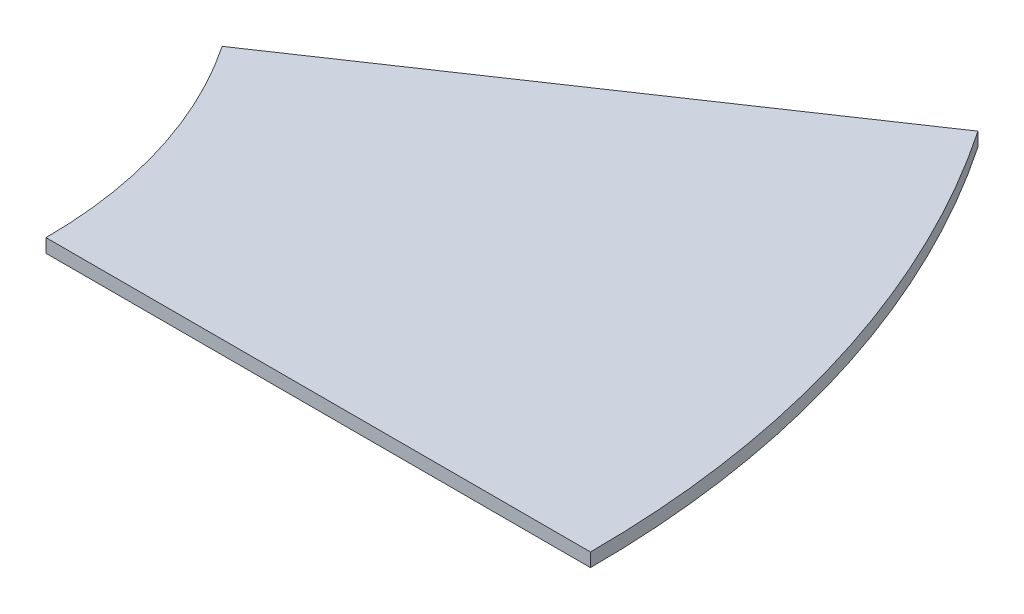
ISO-10303-21;
HEADER;
FILE_DESCRIPTION(('STEP AP214'),'2;1');
FILE_NAME('part.step','',(''),(''),'','','');
FILE_SCHEMA(('AUTOMOTIVE_DESIGN { 1 0 10303 214 1 1 1 1 }'));
ENDSEC;
DATA;
#1=APPLICATION_CONTEXT('core data for automotive mechanical design processes');
#2=APPLICATION_PROTOCOL_DEFINITION('international standard','automotive_design',2000,#1);
#3=PRODUCT_CONTEXT('',#1,'mechanical');
#4=PRODUCT('Part','Part','',(#3));
#5=PRODUCT_RELATED_PRODUCT_CATEGORY('part','',(#4));
#6=PRODUCT_DEFINITION_FORMATION('','',#4);
#7=PRODUCT_DEFINITION_CONTEXT('part definition',#1,'design');
#8=PRODUCT_DEFINITION('design','',#6,#7);
#9=PRODUCT_DEFINITION_SHAPE('','',#8);
#10=(LENGTH_UNIT() NAMED_UNIT(*) SI_UNIT(.MILLI.,.METRE.));
#11=(NAMED_UNIT(*) PLANE_ANGLE_UNIT() SI_UNIT($,.RADIAN.));
#12=(NAMED_UNIT(*) SI_UNIT($,.STERADIAN.) SOLID_ANGLE_UNIT());
#13=UNCERTAINTY_MEASURE_WITH_UNIT(LENGTH_MEASURE(1.E-05),#10,'distance_accuracy_value','');
#14=(GEOMETRIC_REPRESENTATION_CONTEXT(3) GLOBAL_UNCERTAINTY_ASSIGNED_CONTEXT((#13)) GLOBAL_UNIT_ASSIGNED_CONTEXT((#10,
#11,#12)) REPRESENTATION_CONTEXT('',''));
#15=CARTESIAN_POINT('',(0.,0.,0.));
#16=DIRECTION('',(0.,0.,1.));
#17=DIRECTION('',(1.,0.,0.));
#18=AXIS2_PLACEMENT_3D('',#15,#16,#17);
#19=CARTESIAN_POINT('',(0.,1.5,0.));
#20=DIRECTION('',(0.,-1.,0.));
#21=DIRECTION('',(0.,0.,-1.));
#22=AXIS2_PLACEMENT_3D('',#19,#20,#21);
#23=CYLINDRICAL_SURFACE('',#22,110.);
#24=CARTESIAN_POINT('',(0.,0.,0.));
#25=DIRECTION('',(0.,1.,0.));
#26=DIRECTION('',(0.,0.,1.));
#27=AXIS2_PLACEMENT_3D('',#24,#25,#26);
#28=CIRCLE('',#27,110.);
#29=CARTESIAN_POINT('',(110.,0.,0.));
#30=VERTEX_POINT('',#29);
#31=CARTESIAN_POINT('',(91.1941329810549,0.,-61.5112193817816));
#32=VERTEX_POINT('',#31);
#33=EDGE_CURVE('E97',#30,#32,#28,.T.);
#34=ORIENTED_EDGE('',*,*,#33,.T.);
#35=DIRECTION('',(0.,-1.,0.));
#36=VECTOR('',#35,1.);
#37=CARTESIAN_POINT('',(91.1941329810549,1.5,-61.5112193817816));
#38=LINE('',#37,#36);
#39=CARTESIAN_POINT('',(91.1941329810549,1.5,-61.5112193817816));
#40=VERTEX_POINT('',#39);
#41=EDGE_CURVE('E11',#40,#32,#38,.T.);
#42=ORIENTED_EDGE('',*,*,#41,.F.);
#43=CARTESIAN_POINT('',(0.,1.5,0.));
#44=DIRECTION('',(0.,1.,0.));
#45=DIRECTION('',(0.,0.,1.));
#46=AXIS2_PLACEMENT_3D('',#43,#44,#45);
#47=CIRCLE('',#46,110.);
#48=CARTESIAN_POINT('',(110.,1.5,0.));
#49=VERTEX_POINT('',#48);
#50=EDGE_CURVE('E83',#49,#40,#47,.T.);
#51=ORIENTED_EDGE('',*,*,#50,.F.);
#52=DIRECTION('',(0.,-1.,0.));
#53=VECTOR('',#52,1.);
#54=CARTESIAN_POINT('',(110.,1.5,0.));
#55=LINE('',#54,#53);
#56=EDGE_CURVE('E50',#49,#30,#55,.T.);
#57=ORIENTED_EDGE('',*,*,#56,.T.);
#58=EDGE_LOOP('',(#34,#42,#51,#57));
#59=FACE_BOUND('',#58,.T.);
#60=ADVANCED_FACE('F34',(#59),#23,.T.);
#61=CARTESIAN_POINT('',(91.1941329810549,1.5,-61.5112193817816));
#62=DIRECTION('',(0.559192903470742,0.,0.829037572555045));
#63=DIRECTION('',(0.829037572555045,0.,-0.559192903470742));
#64=AXIS2_PLACEMENT_3D('',#61,#62,#63);
#65=PLANE('',#64);
#66=DIRECTION('',(-0.829037572555045,0.,0.559192903470742));
#67=VECTOR('',#66,1.);
#68=CARTESIAN_POINT('',(91.1941329810549,0.,-61.5112193817816));
#69=LINE('',#68,#67);
#70=CARTESIAN_POINT('',(41.4518786277522,0.,-27.9596451735371));
#71=VERTEX_POINT('',#70);
#72=EDGE_CURVE('E88',#32,#71,#69,.T.);
#73=ORIENTED_EDGE('',*,*,#72,.T.);
#74=DIRECTION('',(0.,-1.,0.));
#75=VECTOR('',#74,1.);
#76=CARTESIAN_POINT('',(41.4518786277522,1.5,-27.9596451735371));
#77=LINE('',#76,#75);
#78=CARTESIAN_POINT('',(41.4518786277522,1.5,-27.9596451735371));
#79=VERTEX_POINT('',#78);
#80=EDGE_CURVE('E42',#79,#71,#77,.T.);
#81=ORIENTED_EDGE('',*,*,#80,.F.);
#82=DIRECTION('',(-0.829037572555045,0.,0.559192903470742));
#83=VECTOR('',#82,1.);
#84=CARTESIAN_POINT('',(91.1941329810549,1.5,-61.5112193817816));
#85=LINE('',#84,#83);
#86=EDGE_CURVE('E75',#40,#79,#85,.T.);
#87=ORIENTED_EDGE('',*,*,#86,.F.);
#88=ORIENTED_EDGE('',*,*,#41,.T.);
#89=EDGE_LOOP('',(#73,#81,#87,#88));
#90=FACE_BOUND('',#89,.T.);
#91=ADVANCED_FACE('F87',(#90),#65,.F.);
#92=CARTESIAN_POINT('',(0.,1.5,0.));
#93=DIRECTION('',(0.,-1.,0.));
#94=DIRECTION('',(0.,0.,-1.));
#95=AXIS2_PLACEMENT_3D('',#92,#93,#94);
#96=CYLINDRICAL_SURFACE('',#95,50.);
#97=CARTESIAN_POINT('',(0.,0.,0.));
#98=DIRECTION('',(0.,1.,0.));
#99=DIRECTION('',(0.,0.,1.));
#100=AXIS2_PLACEMENT_3D('',#97,#98,#99);
#101=CIRCLE('',#100,50.);
#102=CARTESIAN_POINT('',(50.,0.,0.));
#103=VERTEX_POINT('',#102);
#104=EDGE_CURVE('E100',#103,#71,#101,.T.);
#105=ORIENTED_EDGE('',*,*,#104,.F.);
#106=DIRECTION('',(0.,-1.,0.));
#107=VECTOR('',#106,1.);
#108=CARTESIAN_POINT('',(50.,1.5,0.));
#109=LINE('',#108,#107);
#110=CARTESIAN_POINT('',(50.,1.5,0.));
#111=VERTEX_POINT('',#110);
#112=EDGE_CURVE('E64',#111,#103,#109,.T.);
#113=ORIENTED_EDGE('',*,*,#112,.F.);
#114=CARTESIAN_POINT('',(0.,1.5,0.));
#115=DIRECTION('',(0.,1.,0.));
#116=DIRECTION('',(0.,0.,1.));
#117=AXIS2_PLACEMENT_3D('',#114,#115,#116);
#118=CIRCLE('',#117,50.);
#119=EDGE_CURVE('E82',#111,#79,#118,.T.);
#120=ORIENTED_EDGE('',*,*,#119,.T.);
#121=ORIENTED_EDGE('',*,*,#80,.T.);
#122=EDGE_LOOP('',(#105,#113,#120,#121));
#123=FACE_BOUND('',#122,.T.);
#124=ADVANCED_FACE('F91',(#123),#96,.F.);
#125=CARTESIAN_POINT('',(110.,1.5,0.));
#126=DIRECTION('',(0.,0.,1.));
#127=DIRECTION('',(1.,0.,0.));
#128=AXIS2_PLACEMENT_3D('',#125,#126,#127);
#129=PLANE('',#128);
#130=DIRECTION('',(-1.,0.,0.));
#131=VECTOR('',#130,1.);
#132=CARTESIAN_POINT('',(110.,0.,0.));
#133=LINE('',#132,#131);
#134=EDGE_CURVE('E102',#30,#103,#133,.T.);
#135=ORIENTED_EDGE('',*,*,#134,.F.);
#136=ORIENTED_EDGE('',*,*,#56,.F.);
#137=DIRECTION('',(-1.,0.,0.));
#138=VECTOR('',#137,1.);
#139=CARTESIAN_POINT('',(110.,1.5,0.));
#140=LINE('',#139,#138);
#141=EDGE_CURVE('E92',#49,#111,#140,.T.);
#142=ORIENTED_EDGE('',*,*,#141,.T.);
#143=ORIENTED_EDGE('',*,*,#112,.T.);
#144=EDGE_LOOP('',(#135,#136,#142,#143));
#145=FACE_BOUND('',#144,.T.);
#146=ADVANCED_FACE('F108',(#145),#129,.T.);
#147=CARTESIAN_POINT('',(0.,1.5,0.));
#148=DIRECTION('',(0.,1.,0.));
#149=DIRECTION('',(0.,0.,1.));
#150=AXIS2_PLACEMENT_3D('',#147,#148,#149);
#151=PLANE('',#150);
#152=ORIENTED_EDGE('',*,*,#50,.T.);
#153=ORIENTED_EDGE('',*,*,#86,.T.);
#154=ORIENTED_EDGE('',*,*,#119,.F.);
#155=ORIENTED_EDGE('',*,*,#141,.F.);
#156=EDGE_LOOP('',(#152,#153,#154,#155));
#157=FACE_BOUND('',#156,.T.);
#158=ADVANCED_FACE('F79',(#157),#151,.T.);
#159=CARTESIAN_POINT('',(0.,0.,0.));
#160=DIRECTION('',(0.,1.,0.));
#161=DIRECTION('',(0.,0.,1.));
#162=AXIS2_PLACEMENT_3D('',#159,#160,#161);
#163=PLANE('',#162);
#164=ORIENTED_EDGE('',*,*,#33,.F.);
#165=ORIENTED_EDGE('',*,*,#134,.T.);
#166=ORIENTED_EDGE('',*,*,#104,.T.);
#167=ORIENTED_EDGE('',*,*,#72,.F.);
#168=EDGE_LOOP('',(#164,#165,#166,#167));
#169=FACE_BOUND('',#168,.T.);
#170=ADVANCED_FACE('F107',(#169),#163,.F.);
#171=CLOSED_SHELL('',(#60,#91,#124,#146,#158,#170));
#172=MANIFOLD_SOLID_BREP('B2',#171);
#173=ADVANCED_BREP_SHAPE_REPRESENTATION('',(#18,#172),#14);
#174=SHAPE_DEFINITION_REPRESENTATION(#9,#173);
ENDSEC;
END-ISO-10303-21;
